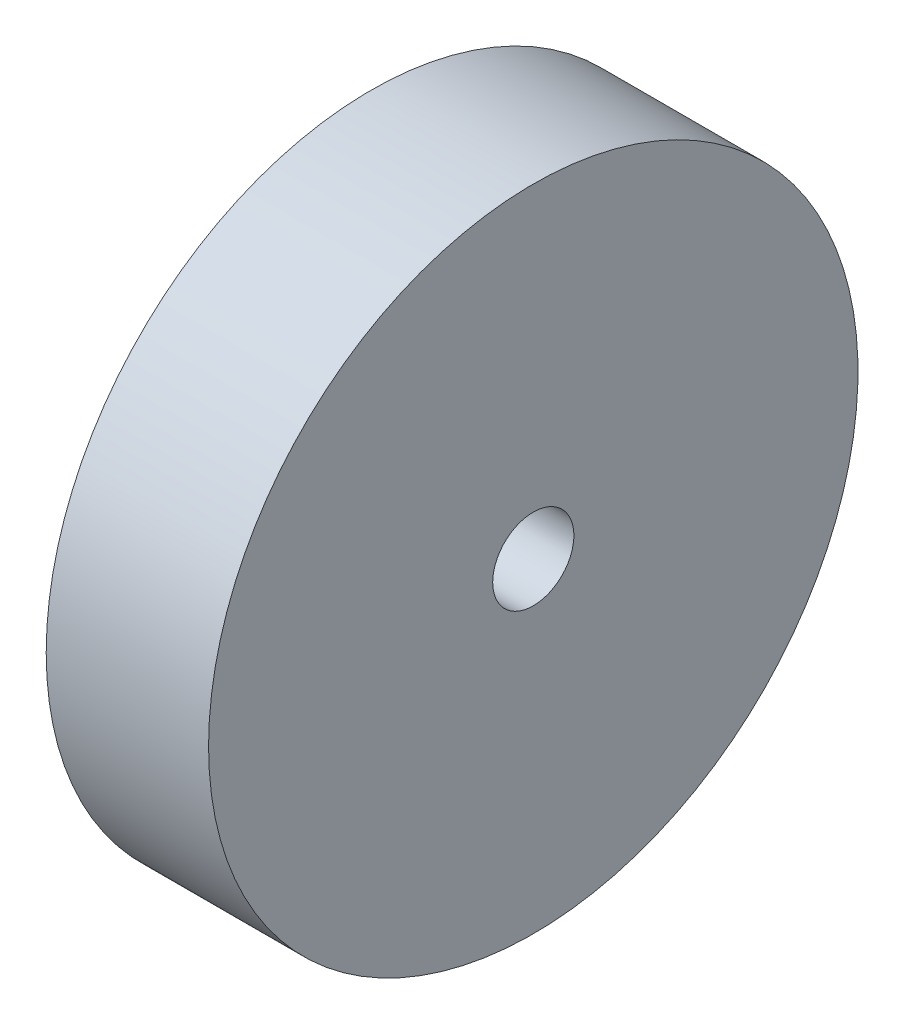
ISO-10303-21;
HEADER;
FILE_DESCRIPTION(('STEP AP214'),'2;1');
FILE_NAME('part.step','',(''),(''),'','','');
FILE_SCHEMA(('AUTOMOTIVE_DESIGN { 1 0 10303 214 1 1 1 1 }'));
ENDSEC;
DATA;
#1=APPLICATION_CONTEXT('core data for automotive mechanical design processes');
#2=APPLICATION_PROTOCOL_DEFINITION('international standard','automotive_design',2000,#1);
#3=PRODUCT_CONTEXT('',#1,'mechanical');
#4=PRODUCT('Part','Part','',(#3));
#5=PRODUCT_RELATED_PRODUCT_CATEGORY('part','',(#4));
#6=PRODUCT_DEFINITION_FORMATION('','',#4);
#7=PRODUCT_DEFINITION_CONTEXT('part definition',#1,'design');
#8=PRODUCT_DEFINITION('design','',#6,#7);
#9=PRODUCT_DEFINITION_SHAPE('','',#8);
#10=(LENGTH_UNIT() NAMED_UNIT(*) SI_UNIT(.MILLI.,.METRE.));
#11=(NAMED_UNIT(*) PLANE_ANGLE_UNIT() SI_UNIT($,.RADIAN.));
#12=(NAMED_UNIT(*) SI_UNIT($,.STERADIAN.) SOLID_ANGLE_UNIT());
#13=UNCERTAINTY_MEASURE_WITH_UNIT(LENGTH_MEASURE(1.E-05),#10,'distance_accuracy_value','');
#14=(GEOMETRIC_REPRESENTATION_CONTEXT(3) GLOBAL_UNCERTAINTY_ASSIGNED_CONTEXT((#13)) GLOBAL_UNIT_ASSIGNED_CONTEXT((#10,
#11,#12)) REPRESENTATION_CONTEXT('',''));
#15=CARTESIAN_POINT('',(0.,0.,0.));
#16=DIRECTION('',(0.,0.,1.));
#17=DIRECTION('',(1.,0.,0.));
#18=AXIS2_PLACEMENT_3D('',#15,#16,#17);
#19=CARTESIAN_POINT('',(-6.35,0.,0.));
#20=DIRECTION('',(-1.,0.,0.));
#21=DIRECTION('',(0.,0.,1.));
#22=AXIS2_PLACEMENT_3D('',#19,#20,#21);
#23=PLANE('',#22);
#24=CARTESIAN_POINT('',(-6.35,0.,0.));
#25=DIRECTION('',(-1.,0.,0.));
#26=DIRECTION('',(0.,0.,1.));
#27=AXIS2_PLACEMENT_3D('',#24,#25,#26);
#28=CIRCLE('',#27,25.4);
#29=CARTESIAN_POINT('',(-6.35,0.,25.4));
#30=VERTEX_POINT('',#29);
#31=EDGE_CURVE('E47',#30,#30,#28,.T.);
#32=ORIENTED_EDGE('',*,*,#31,.T.);
#33=EDGE_LOOP('',(#32));
#34=FACE_BOUND('',#33,.T.);
#35=CARTESIAN_POINT('',(-6.35,0.,0.));
#36=DIRECTION('',(-1.,0.,0.));
#37=DIRECTION('',(0.,0.,1.));
#38=AXIS2_PLACEMENT_3D('',#35,#36,#37);
#39=CIRCLE('',#38,3.175);
#40=CARTESIAN_POINT('',(-6.35,0.,3.175));
#41=VERTEX_POINT('',#40);
#42=EDGE_CURVE('E10',#41,#41,#39,.T.);
#43=ORIENTED_EDGE('',*,*,#42,.F.);
#44=EDGE_LOOP('',(#43));
#45=FACE_BOUND('',#44,.T.);
#46=ADVANCED_FACE('F33',(#34,#45),#23,.T.);
#47=CARTESIAN_POINT('',(-6.35,0.,0.));
#48=DIRECTION('',(-1.,0.,0.));
#49=DIRECTION('',(0.,0.,1.));
#50=AXIS2_PLACEMENT_3D('',#47,#48,#49);
#51=CYLINDRICAL_SURFACE('',#50,3.175);
#52=CARTESIAN_POINT('',(6.35,0.,0.));
#53=DIRECTION('',(-1.,0.,0.));
#54=DIRECTION('',(0.,0.,1.));
#55=AXIS2_PLACEMENT_3D('',#52,#53,#54);
#56=CIRCLE('',#55,3.175);
#57=CARTESIAN_POINT('',(6.35,0.,3.175));
#58=VERTEX_POINT('',#57);
#59=EDGE_CURVE('E39',#58,#58,#56,.T.);
#60=ORIENTED_EDGE('',*,*,#59,.F.);
#61=EDGE_LOOP('',(#60));
#62=FACE_BOUND('',#61,.T.);
#63=ORIENTED_EDGE('',*,*,#42,.T.);
#64=EDGE_LOOP('',(#63));
#65=FACE_BOUND('',#64,.T.);
#66=ADVANCED_FACE('F63',(#62,#65),#51,.F.);
#67=CARTESIAN_POINT('',(6.35,0.,0.));
#68=DIRECTION('',(-1.,0.,0.));
#69=DIRECTION('',(0.,0.,1.));
#70=AXIS2_PLACEMENT_3D('',#67,#68,#69);
#71=PLANE('',#70);
#72=CARTESIAN_POINT('',(6.35,0.,0.));
#73=DIRECTION('',(-1.,0.,0.));
#74=DIRECTION('',(0.,0.,1.));
#75=AXIS2_PLACEMENT_3D('',#72,#73,#74);
#76=CIRCLE('',#75,25.4);
#77=CARTESIAN_POINT('',(6.35,0.,25.4));
#78=VERTEX_POINT('',#77);
#79=EDGE_CURVE('E43',#78,#78,#76,.T.);
#80=ORIENTED_EDGE('',*,*,#79,.F.);
#81=EDGE_LOOP('',(#80));
#82=FACE_BOUND('',#81,.T.);
#83=ORIENTED_EDGE('',*,*,#59,.T.);
#84=EDGE_LOOP('',(#83));
#85=FACE_BOUND('',#84,.T.);
#86=ADVANCED_FACE('F58',(#82,#85),#71,.F.);
#87=CARTESIAN_POINT('',(-6.35,0.,0.));
#88=DIRECTION('',(-1.,0.,0.));
#89=DIRECTION('',(0.,0.,1.));
#90=AXIS2_PLACEMENT_3D('',#87,#88,#89);
#91=CYLINDRICAL_SURFACE('',#90,25.4);
#92=ORIENTED_EDGE('',*,*,#31,.F.);
#93=EDGE_LOOP('',(#92));
#94=FACE_BOUND('',#93,.T.);
#95=ORIENTED_EDGE('',*,*,#79,.T.);
#96=EDGE_LOOP('',(#95));
#97=FACE_BOUND('',#96,.T.);
#98=ADVANCED_FACE('F55',(#94,#97),#91,.T.);
#99=CLOSED_SHELL('',(#46,#66,#86,#98));
#100=MANIFOLD_SOLID_BREP('B2',#99);
#101=ADVANCED_BREP_SHAPE_REPRESENTATION('',(#18,#100),#14);
#102=SHAPE_DEFINITION_REPRESENTATION(#9,#101);
ENDSEC;
END-ISO-10303-21;
